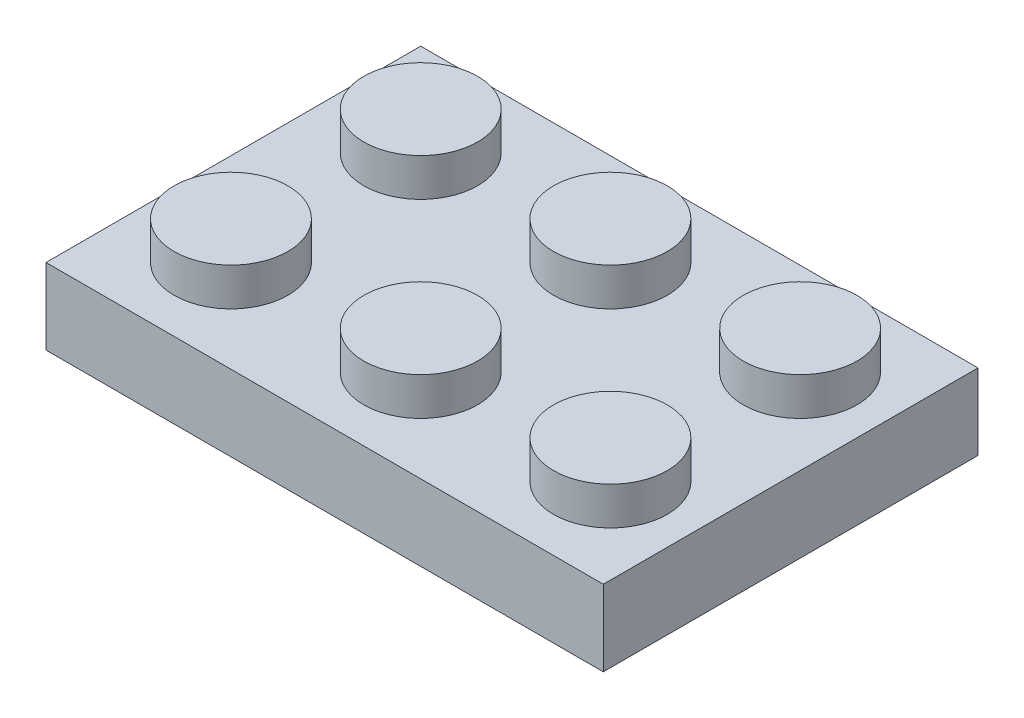
ISO-10303-21;
HEADER;
FILE_DESCRIPTION(('STEP AP214'),'2;1');
FILE_NAME('part.step','',(''),(''),'','','');
FILE_SCHEMA(('AUTOMOTIVE_DESIGN { 1 0 10303 214 1 1 1 1 }'));
ENDSEC;
DATA;
#1=APPLICATION_CONTEXT('core data for automotive mechanical design processes');
#2=APPLICATION_PROTOCOL_DEFINITION('international standard','automotive_design',2000,#1);
#3=PRODUCT_CONTEXT('',#1,'mechanical');
#4=PRODUCT('Part','Part','',(#3));
#5=PRODUCT_RELATED_PRODUCT_CATEGORY('part','',(#4));
#6=PRODUCT_DEFINITION_FORMATION('','',#4);
#7=PRODUCT_DEFINITION_CONTEXT('part definition',#1,'design');
#8=PRODUCT_DEFINITION('design','',#6,#7);
#9=PRODUCT_DEFINITION_SHAPE('','',#8);
#10=(LENGTH_UNIT() NAMED_UNIT(*) SI_UNIT(.MILLI.,.METRE.));
#11=(NAMED_UNIT(*) PLANE_ANGLE_UNIT() SI_UNIT($,.RADIAN.));
#12=(NAMED_UNIT(*) SI_UNIT($,.STERADIAN.) SOLID_ANGLE_UNIT());
#13=UNCERTAINTY_MEASURE_WITH_UNIT(LENGTH_MEASURE(1.E-05),#10,'distance_accuracy_value','');
#14=(GEOMETRIC_REPRESENTATION_CONTEXT(3) GLOBAL_UNCERTAINTY_ASSIGNED_CONTEXT((#13)) GLOBAL_UNIT_ASSIGNED_CONTEXT((#10,
#11,#12)) REPRESENTATION_CONTEXT('',''));
#15=CARTESIAN_POINT('',(0.,0.,0.));
#16=DIRECTION('',(0.,0.,1.));
#17=DIRECTION('',(1.,0.,0.));
#18=AXIS2_PLACEMENT_3D('',#15,#16,#17);
#19=CARTESIAN_POINT('',(0.,0.,-15.8));
#20=DIRECTION('',(0.,-1.,0.));
#21=DIRECTION('',(0.,0.,-1.));
#22=AXIS2_PLACEMENT_3D('',#19,#20,#21);
#23=PLANE('',#22);
#24=DIRECTION('',(1.,0.,0.));
#25=VECTOR('',#24,1.);
#26=CARTESIAN_POINT('',(0.,0.,0.));
#27=LINE('',#26,#25);
#28=CARTESIAN_POINT('',(0.,0.,0.));
#29=VERTEX_POINT('',#28);
#30=CARTESIAN_POINT('',(23.5,0.,0.));
#31=VERTEX_POINT('',#30);
#32=EDGE_CURVE('E237',#29,#31,#27,.T.);
#33=ORIENTED_EDGE('',*,*,#32,.F.);
#34=DIRECTION('',(0.,0.,1.));
#35=VECTOR('',#34,1.);
#36=CARTESIAN_POINT('',(0.,0.,-15.8));
#37=LINE('',#36,#35);
#38=CARTESIAN_POINT('',(0.,0.,-15.8));
#39=VERTEX_POINT('',#38);
#40=EDGE_CURVE('E92',#39,#29,#37,.T.);
#41=ORIENTED_EDGE('',*,*,#40,.F.);
#42=DIRECTION('',(1.,0.,0.));
#43=VECTOR('',#42,1.);
#44=CARTESIAN_POINT('',(0.,0.,-15.8));
#45=LINE('',#44,#43);
#46=CARTESIAN_POINT('',(23.5,0.,-15.8));
#47=VERTEX_POINT('',#46);
#48=EDGE_CURVE('E223',#39,#47,#45,.T.);
#49=ORIENTED_EDGE('',*,*,#48,.T.);
#50=DIRECTION('',(0.,0.,1.));
#51=VECTOR('',#50,1.);
#52=CARTESIAN_POINT('',(23.5,0.,-15.8));
#53=LINE('',#52,#51);
#54=EDGE_CURVE('E254',#47,#31,#53,.T.);
#55=ORIENTED_EDGE('',*,*,#54,.T.);
#56=EDGE_LOOP('',(#33,#41,#49,#55));
#57=FACE_BOUND('',#56,.T.);
#58=DIRECTION('',(0.,0.,1.));
#59=VECTOR('',#58,1.);
#60=CARTESIAN_POINT('',(1.2,0.,-15.8));
#61=LINE('',#60,#59);
#62=CARTESIAN_POINT('',(1.2,0.,-14.6));
#63=VERTEX_POINT('',#62);
#64=CARTESIAN_POINT('',(1.2,0.,-1.2));
#65=VERTEX_POINT('',#64);
#66=EDGE_CURVE('E140',#63,#65,#61,.T.);
#67=ORIENTED_EDGE('',*,*,#66,.T.);
#68=DIRECTION('',(1.,0.,0.));
#69=VECTOR('',#68,1.);
#70=CARTESIAN_POINT('',(0.,0.,-1.2));
#71=LINE('',#70,#69);
#72=CARTESIAN_POINT('',(22.3,0.,-1.2));
#73=VERTEX_POINT('',#72);
#74=EDGE_CURVE('E178',#65,#73,#71,.T.);
#75=ORIENTED_EDGE('',*,*,#74,.T.);
#76=DIRECTION('',(0.,0.,1.));
#77=VECTOR('',#76,1.);
#78=CARTESIAN_POINT('',(22.3,0.,-15.8));
#79=LINE('',#78,#77);
#80=CARTESIAN_POINT('',(22.3,0.,-14.6));
#81=VERTEX_POINT('',#80);
#82=EDGE_CURVE('E129',#81,#73,#79,.T.);
#83=ORIENTED_EDGE('',*,*,#82,.F.);
#84=DIRECTION('',(1.,0.,0.));
#85=VECTOR('',#84,1.);
#86=CARTESIAN_POINT('',(0.,0.,-14.6));
#87=LINE('',#86,#85);
#88=EDGE_CURVE('E57',#63,#81,#87,.T.);
#89=ORIENTED_EDGE('',*,*,#88,.F.);
#90=EDGE_LOOP('',(#67,#75,#83,#89));
#91=FACE_BOUND('',#90,.T.);
#92=ADVANCED_FACE('F41',(#57,#91),#23,.T.);
#93=CARTESIAN_POINT('',(19.9,4.8,-11.9));
#94=DIRECTION('',(0.,1.,0.));
#95=DIRECTION('',(0.,0.,1.));
#96=AXIS2_PLACEMENT_3D('',#93,#94,#95);
#97=PLANE('',#96);
#98=CARTESIAN_POINT('',(19.9,4.8,-11.9));
#99=DIRECTION('',(0.,1.,0.));
#100=DIRECTION('',(0.,0.,1.));
#101=AXIS2_PLACEMENT_3D('',#98,#99,#100);
#102=CIRCLE('',#101,2.4);
#103=CARTESIAN_POINT('',(19.9,4.8,-9.5));
#104=VERTEX_POINT('',#103);
#105=EDGE_CURVE('E286',#104,#104,#102,.T.);
#106=ORIENTED_EDGE('',*,*,#105,.T.);
#107=EDGE_LOOP('',(#106));
#108=FACE_BOUND('',#107,.T.);
#109=ADVANCED_FACE('F43',(#108),#97,.T.);
#110=CARTESIAN_POINT('',(19.9,4.8,-11.9));
#111=DIRECTION('',(0.,-1.,0.));
#112=DIRECTION('',(0.,0.,-1.));
#113=AXIS2_PLACEMENT_3D('',#110,#111,#112);
#114=CYLINDRICAL_SURFACE('',#113,2.4);
#115=ORIENTED_EDGE('',*,*,#105,.F.);
#116=EDGE_LOOP('',(#115));
#117=FACE_BOUND('',#116,.T.);
#118=CARTESIAN_POINT('',(19.9,3.2,-11.9));
#119=DIRECTION('',(0.,1.,0.));
#120=DIRECTION('',(0.,0.,1.));
#121=AXIS2_PLACEMENT_3D('',#118,#119,#120);
#122=CIRCLE('',#121,2.4);
#123=CARTESIAN_POINT('',(19.9,3.2,-9.5));
#124=VERTEX_POINT('',#123);
#125=EDGE_CURVE('E282',#124,#124,#122,.T.);
#126=ORIENTED_EDGE('',*,*,#125,.T.);
#127=EDGE_LOOP('',(#126));
#128=FACE_BOUND('',#127,.T.);
#129=ADVANCED_FACE('F324',(#117,#128),#114,.T.);
#130=CARTESIAN_POINT('',(19.9,4.8,-3.9));
#131=DIRECTION('',(0.,1.,0.));
#132=DIRECTION('',(0.,0.,1.));
#133=AXIS2_PLACEMENT_3D('',#130,#131,#132);
#134=PLANE('',#133);
#135=CARTESIAN_POINT('',(19.9,4.8,-3.9));
#136=DIRECTION('',(0.,1.,0.));
#137=DIRECTION('',(0.,0.,1.));
#138=AXIS2_PLACEMENT_3D('',#135,#136,#137);
#139=CIRCLE('',#138,2.4);
#140=CARTESIAN_POINT('',(19.9,4.8,-1.5));
#141=VERTEX_POINT('',#140);
#142=EDGE_CURVE('E278',#141,#141,#139,.T.);
#143=ORIENTED_EDGE('',*,*,#142,.T.);
#144=EDGE_LOOP('',(#143));
#145=FACE_BOUND('',#144,.T.);
#146=ADVANCED_FACE('F353',(#145),#134,.T.);
#147=CARTESIAN_POINT('',(19.9,4.8,-3.9));
#148=DIRECTION('',(0.,-1.,0.));
#149=DIRECTION('',(0.,0.,-1.));
#150=AXIS2_PLACEMENT_3D('',#147,#148,#149);
#151=CYLINDRICAL_SURFACE('',#150,2.4);
#152=ORIENTED_EDGE('',*,*,#142,.F.);
#153=EDGE_LOOP('',(#152));
#154=FACE_BOUND('',#153,.T.);
#155=CARTESIAN_POINT('',(19.9,3.2,-3.9));
#156=DIRECTION('',(0.,1.,0.));
#157=DIRECTION('',(0.,0.,1.));
#158=AXIS2_PLACEMENT_3D('',#155,#156,#157);
#159=CIRCLE('',#158,2.4);
#160=CARTESIAN_POINT('',(19.9,3.2,-1.5));
#161=VERTEX_POINT('',#160);
#162=EDGE_CURVE('E274',#161,#161,#159,.T.);
#163=ORIENTED_EDGE('',*,*,#162,.T.);
#164=EDGE_LOOP('',(#163));
#165=FACE_BOUND('',#164,.T.);
#166=ADVANCED_FACE('F349',(#154,#165),#151,.T.);
#167=CARTESIAN_POINT('',(11.9,4.8,-11.9));
#168=DIRECTION('',(0.,1.,0.));
#169=DIRECTION('',(0.,0.,1.));
#170=AXIS2_PLACEMENT_3D('',#167,#168,#169);
#171=PLANE('',#170);
#172=CARTESIAN_POINT('',(11.9,4.8,-11.9));
#173=DIRECTION('',(0.,1.,0.));
#174=DIRECTION('',(0.,0.,1.));
#175=AXIS2_PLACEMENT_3D('',#172,#173,#174);
#176=CIRCLE('',#175,2.4);
#177=CARTESIAN_POINT('',(11.9,4.8,-9.5));
#178=VERTEX_POINT('',#177);
#179=EDGE_CURVE('E270',#178,#178,#176,.T.);
#180=ORIENTED_EDGE('',*,*,#179,.T.);
#181=EDGE_LOOP('',(#180));
#182=FACE_BOUND('',#181,.T.);
#183=ADVANCED_FACE('F345',(#182),#171,.T.);
#184=CARTESIAN_POINT('',(11.9,4.8,-11.9));
#185=DIRECTION('',(0.,-1.,0.));
#186=DIRECTION('',(0.,0.,-1.));
#187=AXIS2_PLACEMENT_3D('',#184,#185,#186);
#188=CYLINDRICAL_SURFACE('',#187,2.4);
#189=ORIENTED_EDGE('',*,*,#179,.F.);
#190=EDGE_LOOP('',(#189));
#191=FACE_BOUND('',#190,.T.);
#192=CARTESIAN_POINT('',(11.9,3.2,-11.9));
#193=DIRECTION('',(0.,1.,0.));
#194=DIRECTION('',(0.,0.,1.));
#195=AXIS2_PLACEMENT_3D('',#192,#193,#194);
#196=CIRCLE('',#195,2.4);
#197=CARTESIAN_POINT('',(11.9,3.2,-9.5));
#198=VERTEX_POINT('',#197);
#199=EDGE_CURVE('E266',#198,#198,#196,.T.);
#200=ORIENTED_EDGE('',*,*,#199,.T.);
#201=EDGE_LOOP('',(#200));
#202=FACE_BOUND('',#201,.T.);
#203=ADVANCED_FACE('F341',(#191,#202),#188,.T.);
#204=CARTESIAN_POINT('',(11.9,4.8,-3.9));
#205=DIRECTION('',(0.,1.,0.));
#206=DIRECTION('',(0.,0.,1.));
#207=AXIS2_PLACEMENT_3D('',#204,#205,#206);
#208=PLANE('',#207);
#209=CARTESIAN_POINT('',(11.9,4.8,-3.9));
#210=DIRECTION('',(0.,1.,0.));
#211=DIRECTION('',(0.,0.,1.));
#212=AXIS2_PLACEMENT_3D('',#209,#210,#211);
#213=CIRCLE('',#212,2.4);
#214=CARTESIAN_POINT('',(11.9,4.8,-1.5));
#215=VERTEX_POINT('',#214);
#216=EDGE_CURVE('E262',#215,#215,#213,.T.);
#217=ORIENTED_EDGE('',*,*,#216,.T.);
#218=EDGE_LOOP('',(#217));
#219=FACE_BOUND('',#218,.T.);
#220=ADVANCED_FACE('F337',(#219),#208,.T.);
#221=CARTESIAN_POINT('',(11.9,4.8,-3.9));
#222=DIRECTION('',(0.,-1.,0.));
#223=DIRECTION('',(0.,0.,-1.));
#224=AXIS2_PLACEMENT_3D('',#221,#222,#223);
#225=CYLINDRICAL_SURFACE('',#224,2.4);
#226=ORIENTED_EDGE('',*,*,#216,.F.);
#227=EDGE_LOOP('',(#226));
#228=FACE_BOUND('',#227,.T.);
#229=CARTESIAN_POINT('',(11.9,3.2,-3.9));
#230=DIRECTION('',(0.,1.,0.));
#231=DIRECTION('',(0.,0.,1.));
#232=AXIS2_PLACEMENT_3D('',#229,#230,#231);
#233=CIRCLE('',#232,2.4);
#234=CARTESIAN_POINT('',(11.9,3.2,-1.5));
#235=VERTEX_POINT('',#234);
#236=EDGE_CURVE('E250',#235,#235,#233,.T.);
#237=ORIENTED_EDGE('',*,*,#236,.T.);
#238=EDGE_LOOP('',(#237));
#239=FACE_BOUND('',#238,.T.);
#240=ADVANCED_FACE('F334',(#228,#239),#225,.T.);
#241=CARTESIAN_POINT('',(0.,0.,-15.8));
#242=DIRECTION('',(-1.,0.,0.));
#243=DIRECTION('',(0.,0.,1.));
#244=AXIS2_PLACEMENT_3D('',#241,#242,#243);
#245=PLANE('',#244);
#246=DIRECTION('',(0.,-1.,0.));
#247=VECTOR('',#246,1.);
#248=CARTESIAN_POINT('',(0.,0.,0.));
#249=LINE('',#248,#247);
#250=CARTESIAN_POINT('',(0.,3.2,0.));
#251=VERTEX_POINT('',#250);
#252=EDGE_CURVE('E216',#251,#29,#249,.T.);
#253=ORIENTED_EDGE('',*,*,#252,.F.);
#254=DIRECTION('',(0.,0.,1.));
#255=VECTOR('',#254,1.);
#256=CARTESIAN_POINT('',(0.,3.2,-15.8));
#257=LINE('',#256,#255);
#258=CARTESIAN_POINT('',(0.,3.2,-15.8));
#259=VERTEX_POINT('',#258);
#260=EDGE_CURVE('E66',#259,#251,#257,.T.);
#261=ORIENTED_EDGE('',*,*,#260,.F.);
#262=DIRECTION('',(0.,-1.,0.));
#263=VECTOR('',#262,1.);
#264=CARTESIAN_POINT('',(0.,0.,-15.8));
#265=LINE('',#264,#263);
#266=EDGE_CURVE('E220',#259,#39,#265,.T.);
#267=ORIENTED_EDGE('',*,*,#266,.T.);
#268=ORIENTED_EDGE('',*,*,#40,.T.);
#269=EDGE_LOOP('',(#253,#261,#267,#268));
#270=FACE_BOUND('',#269,.T.);
#271=ADVANCED_FACE('F330',(#270),#245,.T.);
#272=CARTESIAN_POINT('',(0.,3.2,-15.8));
#273=DIRECTION('',(0.,1.,0.));
#274=DIRECTION('',(0.,0.,1.));
#275=AXIS2_PLACEMENT_3D('',#272,#273,#274);
#276=PLANE('',#275);
#277=CARTESIAN_POINT('',(3.9,3.2,-11.9));
#278=DIRECTION('',(0.,1.,0.));
#279=DIRECTION('',(0.,0.,1.));
#280=AXIS2_PLACEMENT_3D('',#277,#278,#279);
#281=CIRCLE('',#280,2.4);
#282=CARTESIAN_POINT('',(3.9,3.2,-9.5));
#283=VERTEX_POINT('',#282);
#284=EDGE_CURVE('E202',#283,#283,#281,.T.);
#285=ORIENTED_EDGE('',*,*,#284,.F.);
#286=EDGE_LOOP('',(#285));
#287=FACE_BOUND('',#286,.T.);
#288=CARTESIAN_POINT('',(3.9,3.2,-3.9));
#289=DIRECTION('',(0.,1.,0.));
#290=DIRECTION('',(0.,0.,1.));
#291=AXIS2_PLACEMENT_3D('',#288,#289,#290);
#292=CIRCLE('',#291,2.4);
#293=CARTESIAN_POINT('',(3.9,3.2,-1.5));
#294=VERTEX_POINT('',#293);
#295=EDGE_CURVE('E211',#294,#294,#292,.T.);
#296=ORIENTED_EDGE('',*,*,#295,.F.);
#297=EDGE_LOOP('',(#296));
#298=FACE_BOUND('',#297,.T.);
#299=DIRECTION('',(-1.,0.,0.));
#300=VECTOR('',#299,1.);
#301=CARTESIAN_POINT('',(0.,3.2,0.));
#302=LINE('',#301,#300);
#303=CARTESIAN_POINT('',(23.5,3.2,0.));
#304=VERTEX_POINT('',#303);
#305=EDGE_CURVE('E224',#304,#251,#302,.T.);
#306=ORIENTED_EDGE('',*,*,#305,.F.);
#307=DIRECTION('',(0.,0.,1.));
#308=VECTOR('',#307,1.);
#309=CARTESIAN_POINT('',(23.5,3.2,-15.8));
#310=LINE('',#309,#308);
#311=CARTESIAN_POINT('',(23.5,3.2,-15.8));
#312=VERTEX_POINT('',#311);
#313=EDGE_CURVE('E251',#312,#304,#310,.T.);
#314=ORIENTED_EDGE('',*,*,#313,.F.);
#315=DIRECTION('',(-1.,0.,0.));
#316=VECTOR('',#315,1.);
#317=CARTESIAN_POINT('',(0.,3.2,-15.8));
#318=LINE('',#317,#316);
#319=EDGE_CURVE('E231',#312,#259,#318,.T.);
#320=ORIENTED_EDGE('',*,*,#319,.T.);
#321=ORIENTED_EDGE('',*,*,#260,.T.);
#322=EDGE_LOOP('',(#306,#314,#320,#321));
#323=FACE_BOUND('',#322,.T.);
#324=ORIENTED_EDGE('',*,*,#236,.F.);
#325=EDGE_LOOP('',(#324));
#326=FACE_BOUND('',#325,.T.);
#327=ORIENTED_EDGE('',*,*,#199,.F.);
#328=EDGE_LOOP('',(#327));
#329=FACE_BOUND('',#328,.T.);
#330=ORIENTED_EDGE('',*,*,#162,.F.);
#331=EDGE_LOOP('',(#330));
#332=FACE_BOUND('',#331,.T.);
#333=ORIENTED_EDGE('',*,*,#125,.F.);
#334=EDGE_LOOP('',(#333));
#335=FACE_BOUND('',#334,.T.);
#336=ADVANCED_FACE('F333',(#287,#298,#323,#326,#329,#332,#335),#276,.T.);
#337=CARTESIAN_POINT('',(23.5,0.,-15.8));
#338=DIRECTION('',(1.,0.,0.));
#339=DIRECTION('',(0.,0.,-1.));
#340=AXIS2_PLACEMENT_3D('',#337,#338,#339);
#341=PLANE('',#340);
#342=DIRECTION('',(0.,1.,0.));
#343=VECTOR('',#342,1.);
#344=CARTESIAN_POINT('',(23.5,0.,0.));
#345=LINE('',#344,#343);
#346=EDGE_CURVE('E241',#31,#304,#345,.T.);
#347=ORIENTED_EDGE('',*,*,#346,.F.);
#348=ORIENTED_EDGE('',*,*,#54,.F.);
#349=DIRECTION('',(0.,1.,0.));
#350=VECTOR('',#349,1.);
#351=CARTESIAN_POINT('',(23.5,0.,-15.8));
#352=LINE('',#351,#350);
#353=EDGE_CURVE('E227',#47,#312,#352,.T.);
#354=ORIENTED_EDGE('',*,*,#353,.T.);
#355=ORIENTED_EDGE('',*,*,#313,.T.);
#356=EDGE_LOOP('',(#347,#348,#354,#355));
#357=FACE_BOUND('',#356,.T.);
#358=ADVANCED_FACE('F328',(#357),#341,.T.);
#359=CARTESIAN_POINT('',(0.,0.,-15.8));
#360=DIRECTION('',(0.,0.,-1.));
#361=DIRECTION('',(-1.,0.,0.));
#362=AXIS2_PLACEMENT_3D('',#359,#360,#361);
#363=PLANE('',#362);
#364=ORIENTED_EDGE('',*,*,#266,.F.);
#365=ORIENTED_EDGE('',*,*,#319,.F.);
#366=ORIENTED_EDGE('',*,*,#353,.F.);
#367=ORIENTED_EDGE('',*,*,#48,.F.);
#368=EDGE_LOOP('',(#364,#365,#366,#367));
#369=FACE_BOUND('',#368,.T.);
#370=ADVANCED_FACE('F370',(#369),#363,.T.);
#371=CARTESIAN_POINT('',(0.,0.,0.));
#372=DIRECTION('',(0.,0.,-1.));
#373=DIRECTION('',(-1.,0.,0.));
#374=AXIS2_PLACEMENT_3D('',#371,#372,#373);
#375=PLANE('',#374);
#376=ORIENTED_EDGE('',*,*,#252,.T.);
#377=ORIENTED_EDGE('',*,*,#32,.T.);
#378=ORIENTED_EDGE('',*,*,#346,.T.);
#379=ORIENTED_EDGE('',*,*,#305,.T.);
#380=EDGE_LOOP('',(#376,#377,#378,#379));
#381=FACE_BOUND('',#380,.T.);
#382=ADVANCED_FACE('F375',(#381),#375,.F.);
#383=CARTESIAN_POINT('',(3.9,4.8,-3.9));
#384=DIRECTION('',(0.,-1.,0.));
#385=DIRECTION('',(0.,0.,-1.));
#386=AXIS2_PLACEMENT_3D('',#383,#384,#385);
#387=CYLINDRICAL_SURFACE('',#386,2.4);
#388=CARTESIAN_POINT('',(3.9,4.8,-3.9));
#389=DIRECTION('',(0.,1.,0.));
#390=DIRECTION('',(0.,0.,1.));
#391=AXIS2_PLACEMENT_3D('',#388,#389,#390);
#392=CIRCLE('',#391,2.4);
#393=CARTESIAN_POINT('',(3.9,4.8,-1.5));
#394=VERTEX_POINT('',#393);
#395=EDGE_CURVE('E212',#394,#394,#392,.T.);
#396=ORIENTED_EDGE('',*,*,#395,.F.);
#397=EDGE_LOOP('',(#396));
#398=FACE_BOUND('',#397,.T.);
#399=ORIENTED_EDGE('',*,*,#295,.T.);
#400=EDGE_LOOP('',(#399));
#401=FACE_BOUND('',#400,.T.);
#402=ADVANCED_FACE('F378',(#398,#401),#387,.T.);
#403=CARTESIAN_POINT('',(3.9,4.8,-3.9));
#404=DIRECTION('',(0.,1.,0.));
#405=DIRECTION('',(0.,0.,1.));
#406=AXIS2_PLACEMENT_3D('',#403,#404,#405);
#407=PLANE('',#406);
#408=ORIENTED_EDGE('',*,*,#395,.T.);
#409=EDGE_LOOP('',(#408));
#410=FACE_BOUND('',#409,.T.);
#411=ADVANCED_FACE('F385',(#410),#407,.T.);
#412=CARTESIAN_POINT('',(3.9,4.8,-11.9));
#413=DIRECTION('',(0.,-1.,0.));
#414=DIRECTION('',(0.,0.,-1.));
#415=AXIS2_PLACEMENT_3D('',#412,#413,#414);
#416=CYLINDRICAL_SURFACE('',#415,2.4);
#417=CARTESIAN_POINT('',(3.9,4.8,-11.9));
#418=DIRECTION('',(0.,1.,0.));
#419=DIRECTION('',(0.,0.,1.));
#420=AXIS2_PLACEMENT_3D('',#417,#418,#419);
#421=CIRCLE('',#420,2.4);
#422=CARTESIAN_POINT('',(3.9,4.8,-9.5));
#423=VERTEX_POINT('',#422);
#424=EDGE_CURVE('E206',#423,#423,#421,.T.);
#425=ORIENTED_EDGE('',*,*,#424,.F.);
#426=EDGE_LOOP('',(#425));
#427=FACE_BOUND('',#426,.T.);
#428=ORIENTED_EDGE('',*,*,#284,.T.);
#429=EDGE_LOOP('',(#428));
#430=FACE_BOUND('',#429,.T.);
#431=ADVANCED_FACE('F389',(#427,#430),#416,.T.);
#432=CARTESIAN_POINT('',(3.9,4.8,-11.9));
#433=DIRECTION('',(0.,1.,0.));
#434=DIRECTION('',(0.,0.,1.));
#435=AXIS2_PLACEMENT_3D('',#432,#433,#434);
#436=PLANE('',#435);
#437=ORIENTED_EDGE('',*,*,#424,.T.);
#438=EDGE_LOOP('',(#437));
#439=FACE_BOUND('',#438,.T.);
#440=ADVANCED_FACE('F393',(#439),#436,.T.);
#441=CARTESIAN_POINT('',(19.9,3.6,-11.9));
#442=DIRECTION('',(0.,1.,0.));
#443=DIRECTION('',(0.,0.,1.));
#444=AXIS2_PLACEMENT_3D('',#441,#442,#443);
#445=PLANE('',#444);
#446=CARTESIAN_POINT('',(19.9,3.6,-11.9));
#447=DIRECTION('',(0.,1.,0.));
#448=DIRECTION('',(0.,0.,1.));
#449=AXIS2_PLACEMENT_3D('',#446,#447,#448);
#450=CIRCLE('',#449,1.2);
#451=CARTESIAN_POINT('',(19.9,3.6,-10.7));
#452=VERTEX_POINT('',#451);
#453=EDGE_CURVE('E207',#452,#452,#450,.T.);
#454=ORIENTED_EDGE('',*,*,#453,.F.);
#455=EDGE_LOOP('',(#454));
#456=FACE_BOUND('',#455,.T.);
#457=ADVANCED_FACE('F397',(#456),#445,.F.);
#458=CARTESIAN_POINT('',(19.9,4.8,-11.9));
#459=DIRECTION('',(0.,-1.,0.));
#460=DIRECTION('',(0.,0.,-1.));
#461=AXIS2_PLACEMENT_3D('',#458,#459,#460);
#462=CYLINDRICAL_SURFACE('',#461,1.2);
#463=ORIENTED_EDGE('',*,*,#453,.T.);
#464=EDGE_LOOP('',(#463));
#465=FACE_BOUND('',#464,.T.);
#466=CARTESIAN_POINT('',(19.9,2.,-11.9));
#467=DIRECTION('',(0.,1.,0.));
#468=DIRECTION('',(0.,0.,1.));
#469=AXIS2_PLACEMENT_3D('',#466,#467,#468);
#470=CIRCLE('',#469,1.2);
#471=CARTESIAN_POINT('',(19.9,2.,-10.7));
#472=VERTEX_POINT('',#471);
#473=EDGE_CURVE('E167',#472,#472,#470,.T.);
#474=ORIENTED_EDGE('',*,*,#473,.F.);
#475=EDGE_LOOP('',(#474));
#476=FACE_BOUND('',#475,.T.);
#477=ADVANCED_FACE('F446',(#465,#476),#462,.F.);
#478=CARTESIAN_POINT('',(19.9,3.6,-3.9));
#479=DIRECTION('',(0.,1.,0.));
#480=DIRECTION('',(0.,0.,1.));
#481=AXIS2_PLACEMENT_3D('',#478,#479,#480);
#482=PLANE('',#481);
#483=CARTESIAN_POINT('',(19.9,3.6,-3.9));
#484=DIRECTION('',(0.,1.,0.));
#485=DIRECTION('',(0.,0.,1.));
#486=AXIS2_PLACEMENT_3D('',#483,#484,#485);
#487=CIRCLE('',#486,1.2);
#488=CARTESIAN_POINT('',(19.9,3.6,-2.7));
#489=VERTEX_POINT('',#488);
#490=EDGE_CURVE('E163',#489,#489,#487,.T.);
#491=ORIENTED_EDGE('',*,*,#490,.F.);
#492=EDGE_LOOP('',(#491));
#493=FACE_BOUND('',#492,.T.);
#494=ADVANCED_FACE('F442',(#493),#482,.F.);
#495=CARTESIAN_POINT('',(19.9,4.8,-3.9));
#496=DIRECTION('',(0.,-1.,0.));
#497=DIRECTION('',(0.,0.,-1.));
#498=AXIS2_PLACEMENT_3D('',#495,#496,#497);
#499=CYLINDRICAL_SURFACE('',#498,1.2);
#500=ORIENTED_EDGE('',*,*,#490,.T.);
#501=EDGE_LOOP('',(#500));
#502=FACE_BOUND('',#501,.T.);
#503=CARTESIAN_POINT('',(19.9,2.,-3.9));
#504=DIRECTION('',(0.,1.,0.));
#505=DIRECTION('',(0.,0.,1.));
#506=AXIS2_PLACEMENT_3D('',#503,#504,#505);
#507=CIRCLE('',#506,1.2);
#508=CARTESIAN_POINT('',(19.9,2.,-2.7));
#509=VERTEX_POINT('',#508);
#510=EDGE_CURVE('E159',#509,#509,#507,.T.);
#511=ORIENTED_EDGE('',*,*,#510,.F.);
#512=EDGE_LOOP('',(#511));
#513=FACE_BOUND('',#512,.T.);
#514=ADVANCED_FACE('F438',(#502,#513),#499,.F.);
#515=CARTESIAN_POINT('',(11.9,3.6,-11.9));
#516=DIRECTION('',(0.,1.,0.));
#517=DIRECTION('',(0.,0.,1.));
#518=AXIS2_PLACEMENT_3D('',#515,#516,#517);
#519=PLANE('',#518);
#520=CARTESIAN_POINT('',(11.9,3.6,-11.9));
#521=DIRECTION('',(0.,1.,0.));
#522=DIRECTION('',(0.,0.,1.));
#523=AXIS2_PLACEMENT_3D('',#520,#521,#522);
#524=CIRCLE('',#523,1.2);
#525=CARTESIAN_POINT('',(11.9,3.6,-10.7));
#526=VERTEX_POINT('',#525);
#527=EDGE_CURVE('E158',#526,#526,#524,.T.);
#528=ORIENTED_EDGE('',*,*,#527,.F.);
#529=EDGE_LOOP('',(#528));
#530=FACE_BOUND('',#529,.T.);
#531=ADVANCED_FACE('F434',(#530),#519,.F.);
#532=CARTESIAN_POINT('',(11.9,4.8,-11.9));
#533=DIRECTION('',(0.,-1.,0.));
#534=DIRECTION('',(0.,0.,-1.));
#535=AXIS2_PLACEMENT_3D('',#532,#533,#534);
#536=CYLINDRICAL_SURFACE('',#535,1.2);
#537=ORIENTED_EDGE('',*,*,#527,.T.);
#538=EDGE_LOOP('',(#537));
#539=FACE_BOUND('',#538,.T.);
#540=CARTESIAN_POINT('',(11.9,2.,-11.9));
#541=DIRECTION('',(0.,1.,0.));
#542=DIRECTION('',(0.,0.,1.));
#543=AXIS2_PLACEMENT_3D('',#540,#541,#542);
#544=CIRCLE('',#543,1.2);
#545=CARTESIAN_POINT('',(11.9,2.,-10.7));
#546=VERTEX_POINT('',#545);
#547=EDGE_CURVE('E154',#546,#546,#544,.T.);
#548=ORIENTED_EDGE('',*,*,#547,.F.);
#549=EDGE_LOOP('',(#548));
#550=FACE_BOUND('',#549,.T.);
#551=ADVANCED_FACE('F430',(#539,#550),#536,.F.);
#552=CARTESIAN_POINT('',(11.9,3.6,-3.9));
#553=DIRECTION('',(0.,1.,0.));
#554=DIRECTION('',(0.,0.,1.));
#555=AXIS2_PLACEMENT_3D('',#552,#553,#554);
#556=PLANE('',#555);
#557=CARTESIAN_POINT('',(11.9,3.6,-3.9));
#558=DIRECTION('',(0.,1.,0.));
#559=DIRECTION('',(0.,0.,1.));
#560=AXIS2_PLACEMENT_3D('',#557,#558,#559);
#561=CIRCLE('',#560,1.2);
#562=CARTESIAN_POINT('',(11.9,3.6,-2.7));
#563=VERTEX_POINT('',#562);
#564=EDGE_CURVE('E153',#563,#563,#561,.T.);
#565=ORIENTED_EDGE('',*,*,#564,.F.);
#566=EDGE_LOOP('',(#565));
#567=FACE_BOUND('',#566,.T.);
#568=ADVANCED_FACE('F426',(#567),#556,.F.);
#569=CARTESIAN_POINT('',(11.9,4.8,-3.9));
#570=DIRECTION('',(0.,-1.,0.));
#571=DIRECTION('',(0.,0.,-1.));
#572=AXIS2_PLACEMENT_3D('',#569,#570,#571);
#573=CYLINDRICAL_SURFACE('',#572,1.2);
#574=ORIENTED_EDGE('',*,*,#564,.T.);
#575=EDGE_LOOP('',(#574));
#576=FACE_BOUND('',#575,.T.);
#577=CARTESIAN_POINT('',(11.9,2.,-3.9));
#578=DIRECTION('',(0.,1.,0.));
#579=DIRECTION('',(0.,0.,1.));
#580=AXIS2_PLACEMENT_3D('',#577,#578,#579);
#581=CIRCLE('',#580,1.2);
#582=CARTESIAN_POINT('',(11.9,2.,-2.7));
#583=VERTEX_POINT('',#582);
#584=EDGE_CURVE('E149',#583,#583,#581,.T.);
#585=ORIENTED_EDGE('',*,*,#584,.F.);
#586=EDGE_LOOP('',(#585));
#587=FACE_BOUND('',#586,.T.);
#588=ADVANCED_FACE('F423',(#576,#587),#573,.F.);
#589=CARTESIAN_POINT('',(1.2,0.,-15.8));
#590=DIRECTION('',(-1.,0.,0.));
#591=DIRECTION('',(0.,0.,1.));
#592=AXIS2_PLACEMENT_3D('',#589,#590,#591);
#593=PLANE('',#592);
#594=DIRECTION('',(0.,-1.,0.));
#595=VECTOR('',#594,1.);
#596=CARTESIAN_POINT('',(1.2,0.,-1.2));
#597=LINE('',#596,#595);
#598=CARTESIAN_POINT('',(1.2,2.,-1.2));
#599=VERTEX_POINT('',#598);
#600=EDGE_CURVE('E174',#599,#65,#597,.T.);
#601=ORIENTED_EDGE('',*,*,#600,.T.);
#602=ORIENTED_EDGE('',*,*,#66,.F.);
#603=DIRECTION('',(0.,-1.,0.));
#604=VECTOR('',#603,1.);
#605=CARTESIAN_POINT('',(1.2,0.,-14.6));
#606=LINE('',#605,#604);
#607=CARTESIAN_POINT('',(1.2,2.,-14.6));
#608=VERTEX_POINT('',#607);
#609=EDGE_CURVE('E180',#608,#63,#606,.T.);
#610=ORIENTED_EDGE('',*,*,#609,.F.);
#611=DIRECTION('',(0.,0.,1.));
#612=VECTOR('',#611,1.);
#613=CARTESIAN_POINT('',(1.2,2.,-15.8));
#614=LINE('',#613,#612);
#615=EDGE_CURVE('E128',#608,#599,#614,.T.);
#616=ORIENTED_EDGE('',*,*,#615,.T.);
#617=EDGE_LOOP('',(#601,#602,#610,#616));
#618=FACE_BOUND('',#617,.T.);
#619=ADVANCED_FACE('F298',(#618),#593,.F.);
#620=CARTESIAN_POINT('',(0.,2.,-15.8));
#621=DIRECTION('',(0.,1.,0.));
#622=DIRECTION('',(0.,0.,1.));
#623=AXIS2_PLACEMENT_3D('',#620,#621,#622);
#624=PLANE('',#623);
#625=CARTESIAN_POINT('',(15.9,2.,-7.9));
#626=DIRECTION('',(0.,1.,0.));
#627=DIRECTION('',(0.,0.,1.));
#628=AXIS2_PLACEMENT_3D('',#625,#626,#627);
#629=CIRCLE('',#628,3.25);
#630=CARTESIAN_POINT('',(15.9,2.,-4.65));
#631=VERTEX_POINT('',#630);
#632=EDGE_CURVE('E12',#631,#631,#629,.F.);
#633=ORIENTED_EDGE('',*,*,#632,.F.);
#634=EDGE_LOOP('',(#633));
#635=FACE_BOUND('',#634,.T.);
#636=CARTESIAN_POINT('',(7.9,2.,-7.9));
#637=DIRECTION('',(0.,1.,0.));
#638=DIRECTION('',(0.,0.,1.));
#639=AXIS2_PLACEMENT_3D('',#636,#637,#638);
#640=CIRCLE('',#639,3.25);
#641=CARTESIAN_POINT('',(7.9,2.,-4.65));
#642=VERTEX_POINT('',#641);
#643=EDGE_CURVE('E50',#642,#642,#640,.F.);
#644=ORIENTED_EDGE('',*,*,#643,.F.);
#645=EDGE_LOOP('',(#644));
#646=FACE_BOUND('',#645,.T.);
#647=CARTESIAN_POINT('',(3.9,2.,-11.9));
#648=DIRECTION('',(0.,1.,0.));
#649=DIRECTION('',(0.,0.,1.));
#650=AXIS2_PLACEMENT_3D('',#647,#648,#649);
#651=CIRCLE('',#650,1.2);
#652=CARTESIAN_POINT('',(3.9,2.,-10.7));
#653=VERTEX_POINT('',#652);
#654=EDGE_CURVE('E193',#653,#653,#651,.T.);
#655=ORIENTED_EDGE('',*,*,#654,.T.);
#656=EDGE_LOOP('',(#655));
#657=FACE_BOUND('',#656,.T.);
#658=CARTESIAN_POINT('',(3.9,2.,-3.9));
#659=DIRECTION('',(0.,1.,0.));
#660=DIRECTION('',(0.,0.,1.));
#661=AXIS2_PLACEMENT_3D('',#658,#659,#660);
#662=CIRCLE('',#661,1.2);
#663=CARTESIAN_POINT('',(3.9,2.,-2.7));
#664=VERTEX_POINT('',#663);
#665=EDGE_CURVE('E189',#664,#664,#662,.T.);
#666=ORIENTED_EDGE('',*,*,#665,.T.);
#667=EDGE_LOOP('',(#666));
#668=FACE_BOUND('',#667,.T.);
#669=DIRECTION('',(-1.,0.,0.));
#670=VECTOR('',#669,1.);
#671=CARTESIAN_POINT('',(0.,2.,-1.2));
#672=LINE('',#671,#670);
#673=CARTESIAN_POINT('',(22.3,2.,-1.2));
#674=VERTEX_POINT('',#673);
#675=EDGE_CURVE('E182',#674,#599,#672,.T.);
#676=ORIENTED_EDGE('',*,*,#675,.T.);
#677=ORIENTED_EDGE('',*,*,#615,.F.);
#678=DIRECTION('',(-1.,0.,0.));
#679=VECTOR('',#678,1.);
#680=CARTESIAN_POINT('',(0.,2.,-14.6));
#681=LINE('',#680,#679);
#682=CARTESIAN_POINT('',(22.3,2.,-14.6));
#683=VERTEX_POINT('',#682);
#684=EDGE_CURVE('E133',#683,#608,#681,.T.);
#685=ORIENTED_EDGE('',*,*,#684,.F.);
#686=DIRECTION('',(0.,0.,1.));
#687=VECTOR('',#686,1.);
#688=CARTESIAN_POINT('',(22.3,2.,-15.8));
#689=LINE('',#688,#687);
#690=EDGE_CURVE('E117',#683,#674,#689,.T.);
#691=ORIENTED_EDGE('',*,*,#690,.T.);
#692=EDGE_LOOP('',(#676,#677,#685,#691));
#693=FACE_BOUND('',#692,.T.);
#694=ORIENTED_EDGE('',*,*,#584,.T.);
#695=EDGE_LOOP('',(#694));
#696=FACE_BOUND('',#695,.T.);
#697=ORIENTED_EDGE('',*,*,#547,.T.);
#698=EDGE_LOOP('',(#697));
#699=FACE_BOUND('',#698,.T.);
#700=ORIENTED_EDGE('',*,*,#510,.T.);
#701=EDGE_LOOP('',(#700));
#702=FACE_BOUND('',#701,.T.);
#703=ORIENTED_EDGE('',*,*,#473,.T.);
#704=EDGE_LOOP('',(#703));
#705=FACE_BOUND('',#704,.T.);
#706=ADVANCED_FACE('F136',(#635,#646,#657,#668,#693,#696,#699,#702,#705),#624,.F.);
#707=CARTESIAN_POINT('',(22.3,0.,-15.8));
#708=DIRECTION('',(1.,0.,0.));
#709=DIRECTION('',(0.,0.,-1.));
#710=AXIS2_PLACEMENT_3D('',#707,#708,#709);
#711=PLANE('',#710);
#712=DIRECTION('',(0.,1.,0.));
#713=VECTOR('',#712,1.);
#714=CARTESIAN_POINT('',(22.3,0.,-1.2));
#715=LINE('',#714,#713);
#716=EDGE_CURVE('E122',#73,#674,#715,.T.);
#717=ORIENTED_EDGE('',*,*,#716,.T.);
#718=ORIENTED_EDGE('',*,*,#690,.F.);
#719=DIRECTION('',(0.,1.,0.));
#720=VECTOR('',#719,1.);
#721=CARTESIAN_POINT('',(22.3,0.,-14.6));
#722=LINE('',#721,#720);
#723=EDGE_CURVE('E119',#81,#683,#722,.T.);
#724=ORIENTED_EDGE('',*,*,#723,.F.);
#725=ORIENTED_EDGE('',*,*,#82,.T.);
#726=EDGE_LOOP('',(#717,#718,#724,#725));
#727=FACE_BOUND('',#726,.T.);
#728=ADVANCED_FACE('F118',(#727),#711,.F.);
#729=CARTESIAN_POINT('',(0.,0.,-14.6));
#730=DIRECTION('',(0.,0.,-1.));
#731=DIRECTION('',(-1.,0.,0.));
#732=AXIS2_PLACEMENT_3D('',#729,#730,#731);
#733=PLANE('',#732);
#734=ORIENTED_EDGE('',*,*,#609,.T.);
#735=ORIENTED_EDGE('',*,*,#88,.T.);
#736=ORIENTED_EDGE('',*,*,#723,.T.);
#737=ORIENTED_EDGE('',*,*,#684,.T.);
#738=EDGE_LOOP('',(#734,#735,#736,#737));
#739=FACE_BOUND('',#738,.T.);
#740=ADVANCED_FACE('F132',(#739),#733,.F.);
#741=CARTESIAN_POINT('',(0.,0.,-1.2));
#742=DIRECTION('',(0.,0.,-1.));
#743=DIRECTION('',(-1.,0.,0.));
#744=AXIS2_PLACEMENT_3D('',#741,#742,#743);
#745=PLANE('',#744);
#746=ORIENTED_EDGE('',*,*,#600,.F.);
#747=ORIENTED_EDGE('',*,*,#675,.F.);
#748=ORIENTED_EDGE('',*,*,#716,.F.);
#749=ORIENTED_EDGE('',*,*,#74,.F.);
#750=EDGE_LOOP('',(#746,#747,#748,#749));
#751=FACE_BOUND('',#750,.T.);
#752=ADVANCED_FACE('F316',(#751),#745,.T.);
#753=CARTESIAN_POINT('',(3.9,4.8,-3.9));
#754=DIRECTION('',(0.,-1.,0.));
#755=DIRECTION('',(0.,0.,-1.));
#756=AXIS2_PLACEMENT_3D('',#753,#754,#755);
#757=CYLINDRICAL_SURFACE('',#756,1.2);
#758=CARTESIAN_POINT('',(3.9,3.6,-3.9));
#759=DIRECTION('',(0.,1.,0.));
#760=DIRECTION('',(0.,0.,1.));
#761=AXIS2_PLACEMENT_3D('',#758,#759,#760);
#762=CIRCLE('',#761,1.2);
#763=CARTESIAN_POINT('',(3.9,3.6,-2.7));
#764=VERTEX_POINT('',#763);
#765=EDGE_CURVE('E179',#764,#764,#762,.T.);
#766=ORIENTED_EDGE('',*,*,#765,.T.);
#767=EDGE_LOOP('',(#766));
#768=FACE_BOUND('',#767,.T.);
#769=ORIENTED_EDGE('',*,*,#665,.F.);
#770=EDGE_LOOP('',(#769));
#771=FACE_BOUND('',#770,.T.);
#772=ADVANCED_FACE('F410',(#768,#771),#757,.F.);
#773=CARTESIAN_POINT('',(3.9,3.6,-3.9));
#774=DIRECTION('',(0.,1.,0.));
#775=DIRECTION('',(0.,0.,1.));
#776=AXIS2_PLACEMENT_3D('',#773,#774,#775);
#777=PLANE('',#776);
#778=ORIENTED_EDGE('',*,*,#765,.F.);
#779=EDGE_LOOP('',(#778));
#780=FACE_BOUND('',#779,.T.);
#781=ADVANCED_FACE('F406',(#780),#777,.F.);
#782=CARTESIAN_POINT('',(3.9,4.8,-11.9));
#783=DIRECTION('',(0.,-1.,0.));
#784=DIRECTION('',(0.,0.,-1.));
#785=AXIS2_PLACEMENT_3D('',#782,#783,#784);
#786=CYLINDRICAL_SURFACE('',#785,1.2);
#787=CARTESIAN_POINT('',(3.9,3.6,-11.9));
#788=DIRECTION('',(0.,1.,0.));
#789=DIRECTION('',(0.,0.,1.));
#790=AXIS2_PLACEMENT_3D('',#787,#788,#789);
#791=CIRCLE('',#790,1.2);
#792=CARTESIAN_POINT('',(3.9,3.6,-10.7));
#793=VERTEX_POINT('',#792);
#794=EDGE_CURVE('E190',#793,#793,#791,.T.);
#795=ORIENTED_EDGE('',*,*,#794,.T.);
#796=EDGE_LOOP('',(#795));
#797=FACE_BOUND('',#796,.T.);
#798=ORIENTED_EDGE('',*,*,#654,.F.);
#799=EDGE_LOOP('',(#798));
#800=FACE_BOUND('',#799,.T.);
#801=ADVANCED_FACE('F402',(#797,#800),#786,.F.);
#802=CARTESIAN_POINT('',(3.9,3.6,-11.9));
#803=DIRECTION('',(0.,1.,0.));
#804=DIRECTION('',(0.,0.,1.));
#805=AXIS2_PLACEMENT_3D('',#802,#803,#804);
#806=PLANE('',#805);
#807=ORIENTED_EDGE('',*,*,#794,.F.);
#808=EDGE_LOOP('',(#807));
#809=FACE_BOUND('',#808,.T.);
#810=ADVANCED_FACE('F399',(#809),#806,.F.);
#811=CARTESIAN_POINT('',(7.9,-9.19238815542512,-7.9));
#812=DIRECTION('',(0.,1.,0.));
#813=DIRECTION('',(0.,0.,1.));
#814=AXIS2_PLACEMENT_3D('',#811,#812,#813);
#815=CYLINDRICAL_SURFACE('',#814,3.25);
#816=ORIENTED_EDGE('',*,*,#643,.T.);
#817=EDGE_LOOP('',(#816));
#818=FACE_BOUND('',#817,.T.);
#819=CARTESIAN_POINT('',(7.9,0.200000000000001,-7.9));
#820=DIRECTION('',(0.,-1.,0.));
#821=DIRECTION('',(0.,0.,-1.));
#822=AXIS2_PLACEMENT_3D('',#819,#820,#821);
#823=CIRCLE('',#822,3.25);
#824=CARTESIAN_POINT('',(7.9,0.200000000000001,-11.15));
#825=VERTEX_POINT('',#824);
#826=EDGE_CURVE('E501',#825,#825,#823,.T.);
#827=ORIENTED_EDGE('',*,*,#826,.F.);
#828=EDGE_LOOP('',(#827));
#829=FACE_BOUND('',#828,.T.);
#830=ADVANCED_FACE('F293',(#818,#829),#815,.T.);
#831=CARTESIAN_POINT('',(7.9,-9.19238815542512,-7.9));
#832=DIRECTION('',(0.,1.,0.));
#833=DIRECTION('',(0.,0.,1.));
#834=AXIS2_PLACEMENT_3D('',#831,#832,#833);
#835=CYLINDRICAL_SURFACE('',#834,2.4);
#836=CARTESIAN_POINT('',(7.9,2.,-7.9));
#837=DIRECTION('',(0.,-1.,0.));
#838=DIRECTION('',(0.,0.,-1.));
#839=AXIS2_PLACEMENT_3D('',#836,#837,#838);
#840=CIRCLE('',#839,2.4);
#841=CARTESIAN_POINT('',(7.9,2.,-10.3));
#842=VERTEX_POINT('',#841);
#843=EDGE_CURVE('E494',#842,#842,#840,.T.);
#844=ORIENTED_EDGE('',*,*,#843,.F.);
#845=EDGE_LOOP('',(#844));
#846=FACE_BOUND('',#845,.T.);
#847=CARTESIAN_POINT('',(7.9,0.200000000000001,-7.9));
#848=DIRECTION('',(0.,-1.,0.));
#849=DIRECTION('',(0.,0.,-1.));
#850=AXIS2_PLACEMENT_3D('',#847,#848,#849);
#851=CIRCLE('',#850,2.4);
#852=CARTESIAN_POINT('',(7.9,0.200000000000001,-10.3));
#853=VERTEX_POINT('',#852);
#854=EDGE_CURVE('E488',#853,#853,#851,.T.);
#855=ORIENTED_EDGE('',*,*,#854,.T.);
#856=EDGE_LOOP('',(#855));
#857=FACE_BOUND('',#856,.T.);
#858=ADVANCED_FACE('F456',(#846,#857),#835,.F.);
#859=CARTESIAN_POINT('',(0.,0.2,-15.8));
#860=DIRECTION('',(0.,-1.,0.));
#861=DIRECTION('',(0.,0.,-1.));
#862=AXIS2_PLACEMENT_3D('',#859,#860,#861);
#863=PLANE('',#862);
#864=ORIENTED_EDGE('',*,*,#854,.F.);
#865=EDGE_LOOP('',(#864));
#866=FACE_BOUND('',#865,.T.);
#867=ORIENTED_EDGE('',*,*,#826,.T.);
#868=EDGE_LOOP('',(#867));
#869=FACE_BOUND('',#868,.T.);
#870=ADVANCED_FACE('F459',(#866,#869),#863,.T.);
#871=ORIENTED_EDGE('',*,*,#843,.T.);
#872=EDGE_LOOP('',(#871));
#873=FACE_BOUND('',#872,.T.);
#874=ADVANCED_FACE('F302',(#873),#624,.F.);
#875=CARTESIAN_POINT('',(15.9,-9.19238815542512,-7.9));
#876=DIRECTION('',(0.,1.,0.));
#877=DIRECTION('',(0.,0.,1.));
#878=AXIS2_PLACEMENT_3D('',#875,#876,#877);
#879=CYLINDRICAL_SURFACE('',#878,3.25);
#880=ORIENTED_EDGE('',*,*,#632,.T.);
#881=EDGE_LOOP('',(#880));
#882=FACE_BOUND('',#881,.T.);
#883=CARTESIAN_POINT('',(15.9,0.200000000000001,-7.9));
#884=DIRECTION('',(0.,-1.,0.));
#885=DIRECTION('',(0.,0.,-1.));
#886=AXIS2_PLACEMENT_3D('',#883,#884,#885);
#887=CIRCLE('',#886,3.25);
#888=CARTESIAN_POINT('',(15.9,0.200000000000001,-11.15));
#889=VERTEX_POINT('',#888);
#890=EDGE_CURVE('E485',#889,#889,#887,.T.);
#891=ORIENTED_EDGE('',*,*,#890,.F.);
#892=EDGE_LOOP('',(#891));
#893=FACE_BOUND('',#892,.T.);
#894=ADVANCED_FACE('F464',(#882,#893),#879,.T.);
#895=CARTESIAN_POINT('',(15.9,-9.19238815542512,-7.9));
#896=DIRECTION('',(0.,1.,0.));
#897=DIRECTION('',(0.,0.,1.));
#898=AXIS2_PLACEMENT_3D('',#895,#896,#897);
#899=CYLINDRICAL_SURFACE('',#898,2.4);
#900=CARTESIAN_POINT('',(15.9,2.,-7.9));
#901=DIRECTION('',(0.,-1.,0.));
#902=DIRECTION('',(0.,0.,-1.));
#903=AXIS2_PLACEMENT_3D('',#900,#901,#902);
#904=CIRCLE('',#903,2.4);
#905=CARTESIAN_POINT('',(15.9,2.,-10.3));
#906=VERTEX_POINT('',#905);
#907=EDGE_CURVE('E489',#906,#906,#904,.T.);
#908=ORIENTED_EDGE('',*,*,#907,.F.);
#909=EDGE_LOOP('',(#908));
#910=FACE_BOUND('',#909,.T.);
#911=CARTESIAN_POINT('',(15.9,0.200000000000001,-7.9));
#912=DIRECTION('',(0.,-1.,0.));
#913=DIRECTION('',(0.,0.,-1.));
#914=AXIS2_PLACEMENT_3D('',#911,#912,#913);
#915=CIRCLE('',#914,2.4);
#916=CARTESIAN_POINT('',(15.9,0.200000000000001,-10.3));
#917=VERTEX_POINT('',#916);
#918=EDGE_CURVE('E482',#917,#917,#915,.T.);
#919=ORIENTED_EDGE('',*,*,#918,.T.);
#920=EDGE_LOOP('',(#919));
#921=FACE_BOUND('',#920,.T.);
#922=ADVANCED_FACE('F467',(#910,#921),#899,.F.);
#923=CARTESIAN_POINT('',(0.,0.2,-15.8));
#924=DIRECTION('',(0.,-1.,0.));
#925=DIRECTION('',(0.,0.,-1.));
#926=AXIS2_PLACEMENT_3D('',#923,#924,#925);
#927=PLANE('',#926);
#928=ORIENTED_EDGE('',*,*,#918,.F.);
#929=EDGE_LOOP('',(#928));
#930=FACE_BOUND('',#929,.T.);
#931=ORIENTED_EDGE('',*,*,#890,.T.);
#932=EDGE_LOOP('',(#931));
#933=FACE_BOUND('',#932,.T.);
#934=ADVANCED_FACE('F471',(#930,#933),#927,.T.);
#935=ORIENTED_EDGE('',*,*,#907,.T.);
#936=EDGE_LOOP('',(#935));
#937=FACE_BOUND('',#936,.T.);
#938=ADVANCED_FACE('F301',(#937),#624,.F.);
#939=CLOSED_SHELL('',(#92,#109,#129,#146,#166,#183,#203,#220,#240,#271,#336,#358,#370,#382,#402,
#411,#431,#440,#457,#477,#494,#514,#531,#551,#568,#588,#619,#706,#728,#740,#752,#772,#781,#801,
#810,#830,#858,#870,#874,#894,#922,#934,#938));
#940=MANIFOLD_SOLID_BREP('B2',#939);
#941=ADVANCED_BREP_SHAPE_REPRESENTATION('',(#18,#940),#14);
#942=SHAPE_DEFINITION_REPRESENTATION(#9,#941);
ENDSEC;
END-ISO-10303-21;
